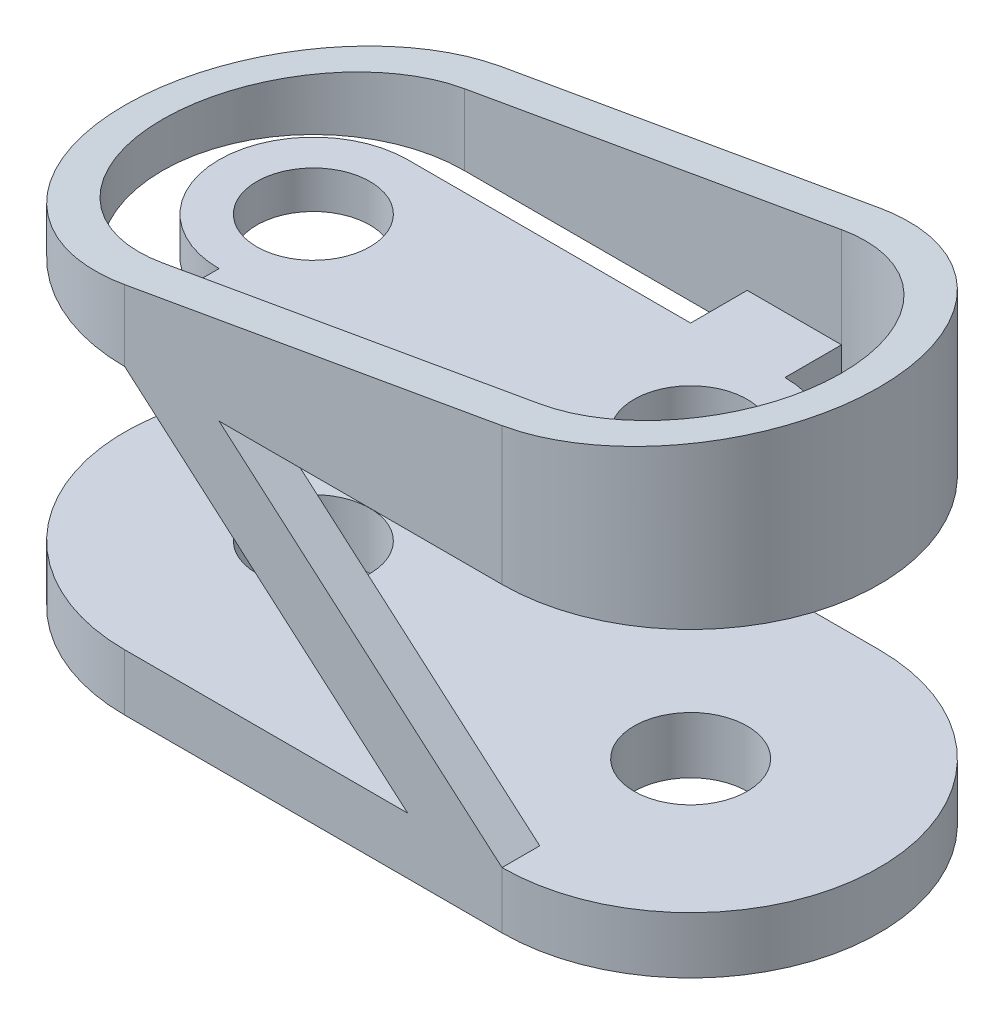
ISO-10303-21;
HEADER;
FILE_DESCRIPTION(('STEP AP214'),'2;1');
FILE_NAME('part.step','',(''),(''),'','','');
FILE_SCHEMA(('AUTOMOTIVE_DESIGN { 1 0 10303 214 1 1 1 1 }'));
ENDSEC;
DATA;
#1=APPLICATION_CONTEXT('core data for automotive mechanical design processes');
#2=APPLICATION_PROTOCOL_DEFINITION('international standard','automotive_design',2000,#1);
#3=PRODUCT_CONTEXT('',#1,'mechanical');
#4=PRODUCT('Part','Part','',(#3));
#5=PRODUCT_RELATED_PRODUCT_CATEGORY('part','',(#4));
#6=PRODUCT_DEFINITION_FORMATION('','',#4);
#7=PRODUCT_DEFINITION_CONTEXT('part definition',#1,'design');
#8=PRODUCT_DEFINITION('design','',#6,#7);
#9=PRODUCT_DEFINITION_SHAPE('','',#8);
#10=(LENGTH_UNIT() NAMED_UNIT(*) SI_UNIT(.MILLI.,.METRE.));
#11=(NAMED_UNIT(*) PLANE_ANGLE_UNIT() SI_UNIT($,.RADIAN.));
#12=(NAMED_UNIT(*) SI_UNIT($,.STERADIAN.) SOLID_ANGLE_UNIT());
#13=UNCERTAINTY_MEASURE_WITH_UNIT(LENGTH_MEASURE(1.E-05),#10,'distance_accuracy_value','');
#14=(GEOMETRIC_REPRESENTATION_CONTEXT(3) GLOBAL_UNCERTAINTY_ASSIGNED_CONTEXT((#13)) GLOBAL_UNIT_ASSIGNED_CONTEXT((#10,
#11,#12)) REPRESENTATION_CONTEXT('',''));
#15=CARTESIAN_POINT('',(0.,0.,0.));
#16=DIRECTION('',(0.,0.,1.));
#17=DIRECTION('',(1.,0.,0.));
#18=AXIS2_PLACEMENT_3D('',#15,#16,#17);
#19=CARTESIAN_POINT('',(0.,90.,-50.));
#20=DIRECTION('',(0.,0.,-1.));
#21=DIRECTION('',(-1.,0.,0.));
#22=AXIS2_PLACEMENT_3D('',#19,#20,#21);
#23=PLANE('',#22);
#24=DIRECTION('',(0.755689082789818,0.654930538417842,0.));
#25=VECTOR('',#24,1.);
#26=CARTESIAN_POINT('',(25.,80.,-50.));
#27=LINE('',#26,#25);
#28=CARTESIAN_POINT('',(-50.,15.,-50.));
#29=VERTEX_POINT('',#28);
#30=CARTESIAN_POINT('',(25.,80.,-50.));
#31=VERTEX_POINT('',#30);
#32=EDGE_CURVE('E320',#29,#31,#27,.T.);
#33=ORIENTED_EDGE('',*,*,#32,.T.);
#34=DIRECTION('',(1.,0.,0.));
#35=VECTOR('',#34,1.);
#36=CARTESIAN_POINT('',(50.,80.,-50.));
#37=LINE('',#36,#35);
#38=CARTESIAN_POINT('',(-50.,80.,-50.));
#39=VERTEX_POINT('',#38);
#40=EDGE_CURVE('E257',#39,#31,#37,.T.);
#41=ORIENTED_EDGE('',*,*,#40,.F.);
#42=DIRECTION('',(0.,-1.,0.));
#43=VECTOR('',#42,1.);
#44=CARTESIAN_POINT('',(-50.,150.,-50.));
#45=LINE('',#44,#43);
#46=CARTESIAN_POINT('',(-50.,98.8163490354229,-50.));
#47=VERTEX_POINT('',#46);
#48=EDGE_CURVE('E294',#47,#39,#45,.T.);
#49=ORIENTED_EDGE('',*,*,#48,.F.);
#50=DIRECTION('',(0.984807753012209,0.173648177666924,0.));
#51=VECTOR('',#50,1.);
#52=CARTESIAN_POINT('',(-3.01536896070435,107.101007166283,-50.));
#53=LINE('',#52,#51);
#54=CARTESIAN_POINT('',(50.,116.449047106269,-50.));
#55=VERTEX_POINT('',#54);
#56=EDGE_CURVE('E286',#47,#55,#53,.T.);
#57=ORIENTED_EDGE('',*,*,#56,.T.);
#58=DIRECTION('',(0.,-1.,0.));
#59=VECTOR('',#58,1.);
#60=CARTESIAN_POINT('',(50.,90.,-50.));
#61=LINE('',#60,#59);
#62=CARTESIAN_POINT('',(50.,80.,-50.));
#63=VERTEX_POINT('',#62);
#64=EDGE_CURVE('E536',#55,#63,#61,.T.);
#65=ORIENTED_EDGE('',*,*,#64,.T.);
#66=DIRECTION('',(-0.755689082789818,-0.654930538417842,0.));
#67=VECTOR('',#66,1.);
#68=CARTESIAN_POINT('',(-25.,15.,-50.));
#69=LINE('',#68,#67);
#70=CARTESIAN_POINT('',(-25.,15.,-50.));
#71=VERTEX_POINT('',#70);
#72=EDGE_CURVE('E219',#63,#71,#69,.T.);
#73=ORIENTED_EDGE('',*,*,#72,.T.);
#74=DIRECTION('',(1.,0.,0.));
#75=VECTOR('',#74,1.);
#76=CARTESIAN_POINT('',(0.,15.,-50.));
#77=LINE('',#76,#75);
#78=CARTESIAN_POINT('',(50.,15.,-50.));
#79=VERTEX_POINT('',#78);
#80=EDGE_CURVE('E353',#71,#79,#77,.T.);
#81=ORIENTED_EDGE('',*,*,#80,.T.);
#82=DIRECTION('',(0.,-1.,0.));
#83=VECTOR('',#82,1.);
#84=CARTESIAN_POINT('',(50.,15.,-50.));
#85=LINE('',#84,#83);
#86=CARTESIAN_POINT('',(50.,0.,-50.));
#87=VERTEX_POINT('',#86);
#88=EDGE_CURVE('E403',#79,#87,#85,.T.);
#89=ORIENTED_EDGE('',*,*,#88,.T.);
#90=DIRECTION('',(1.,0.,0.));
#91=VECTOR('',#90,1.);
#92=CARTESIAN_POINT('',(0.,0.,-50.));
#93=LINE('',#92,#91);
#94=CARTESIAN_POINT('',(-50.,0.,-50.));
#95=VERTEX_POINT('',#94);
#96=EDGE_CURVE('E376',#95,#87,#93,.T.);
#97=ORIENTED_EDGE('',*,*,#96,.F.);
#98=DIRECTION('',(0.,-1.,0.));
#99=VECTOR('',#98,1.);
#100=CARTESIAN_POINT('',(-50.,15.,-50.));
#101=LINE('',#100,#99);
#102=EDGE_CURVE('E400',#29,#95,#101,.T.);
#103=ORIENTED_EDGE('',*,*,#102,.F.);
#104=EDGE_LOOP('',(#33,#41,#49,#57,#65,#73,#81,#89,#97,#103));
#105=FACE_BOUND('',#104,.T.);
#106=ADVANCED_FACE('F41',(#105),#23,.T.);
#107=CARTESIAN_POINT('',(0.,90.,50.));
#108=DIRECTION('',(0.,0.,1.));
#109=DIRECTION('',(1.,0.,0.));
#110=AXIS2_PLACEMENT_3D('',#107,#108,#109);
#111=PLANE('',#110);
#112=DIRECTION('',(-0.755689082789818,0.654930538417842,0.));
#113=VECTOR('',#112,1.);
#114=CARTESIAN_POINT('',(50.,15.,50.));
#115=LINE('',#114,#113);
#116=CARTESIAN_POINT('',(50.,15.,50.));
#117=VERTEX_POINT('',#116);
#118=CARTESIAN_POINT('',(-25.,80.,50.));
#119=VERTEX_POINT('',#118);
#120=EDGE_CURVE('E406',#117,#119,#115,.T.);
#121=ORIENTED_EDGE('',*,*,#120,.T.);
#122=DIRECTION('',(-1.,0.,0.));
#123=VECTOR('',#122,1.);
#124=CARTESIAN_POINT('',(-27.6840938328746,80.,50.));
#125=LINE('',#124,#123);
#126=CARTESIAN_POINT('',(50.,80.,50.));
#127=VERTEX_POINT('',#126);
#128=EDGE_CURVE('E250',#127,#119,#125,.T.);
#129=ORIENTED_EDGE('',*,*,#128,.F.);
#130=DIRECTION('',(0.,-1.,0.));
#131=VECTOR('',#130,1.);
#132=CARTESIAN_POINT('',(50.,150.,50.));
#133=LINE('',#132,#131);
#134=CARTESIAN_POINT('',(50.,116.449047106269,50.));
#135=VERTEX_POINT('',#134);
#136=EDGE_CURVE('E307',#135,#127,#133,.T.);
#137=ORIENTED_EDGE('',*,*,#136,.F.);
#138=DIRECTION('',(-0.984807753012209,-0.173648177666924,0.));
#139=VECTOR('',#138,1.);
#140=CARTESIAN_POINT('',(-3.01536896070435,107.101007166283,50.));
#141=LINE('',#140,#139);
#142=CARTESIAN_POINT('',(-50.,98.8163490354229,50.));
#143=VERTEX_POINT('',#142);
#144=EDGE_CURVE('E282',#135,#143,#141,.T.);
#145=ORIENTED_EDGE('',*,*,#144,.T.);
#146=DIRECTION('',(0.,-1.,0.));
#147=VECTOR('',#146,1.);
#148=CARTESIAN_POINT('',(-50.,90.,50.));
#149=LINE('',#148,#147);
#150=CARTESIAN_POINT('',(-50.,80.,50.));
#151=VERTEX_POINT('',#150);
#152=EDGE_CURVE('E521',#143,#151,#149,.T.);
#153=ORIENTED_EDGE('',*,*,#152,.T.);
#154=DIRECTION('',(0.755689082789818,-0.654930538417842,0.));
#155=VECTOR('',#154,1.);
#156=CARTESIAN_POINT('',(-50.,80.,50.));
#157=LINE('',#156,#155);
#158=CARTESIAN_POINT('',(25.,15.,50.));
#159=VERTEX_POINT('',#158);
#160=EDGE_CURVE('E412',#151,#159,#157,.T.);
#161=ORIENTED_EDGE('',*,*,#160,.T.);
#162=DIRECTION('',(-1.,0.,0.));
#163=VECTOR('',#162,1.);
#164=CARTESIAN_POINT('',(0.,15.,50.));
#165=LINE('',#164,#163);
#166=CARTESIAN_POINT('',(-50.,15.,50.));
#167=VERTEX_POINT('',#166);
#168=EDGE_CURVE('E361',#159,#167,#165,.T.);
#169=ORIENTED_EDGE('',*,*,#168,.T.);
#170=DIRECTION('',(0.,-1.,0.));
#171=VECTOR('',#170,1.);
#172=CARTESIAN_POINT('',(-50.,15.,50.));
#173=LINE('',#172,#171);
#174=CARTESIAN_POINT('',(-50.,0.,50.));
#175=VERTEX_POINT('',#174);
#176=EDGE_CURVE('E397',#167,#175,#173,.T.);
#177=ORIENTED_EDGE('',*,*,#176,.T.);
#178=DIRECTION('',(-1.,0.,0.));
#179=VECTOR('',#178,1.);
#180=CARTESIAN_POINT('',(0.,0.,50.));
#181=LINE('',#180,#179);
#182=CARTESIAN_POINT('',(50.,0.,50.));
#183=VERTEX_POINT('',#182);
#184=EDGE_CURVE('E384',#183,#175,#181,.T.);
#185=ORIENTED_EDGE('',*,*,#184,.F.);
#186=DIRECTION('',(0.,-1.,0.));
#187=VECTOR('',#186,1.);
#188=CARTESIAN_POINT('',(50.,15.,50.));
#189=LINE('',#188,#187);
#190=EDGE_CURVE('E372',#117,#183,#189,.T.);
#191=ORIENTED_EDGE('',*,*,#190,.F.);
#192=EDGE_LOOP('',(#121,#129,#137,#145,#153,#161,#169,#177,#185,#191));
#193=FACE_BOUND('',#192,.T.);
#194=ADVANCED_FACE('F628',(#193),#111,.T.);
#195=CARTESIAN_POINT('',(50.,150.,0.));
#196=DIRECTION('',(0.,-1.,0.));
#197=DIRECTION('',(0.,0.,-1.));
#198=AXIS2_PLACEMENT_3D('',#195,#196,#197);
#199=CYLINDRICAL_SURFACE('',#198,40.);
#200=DIRECTION('',(0.,-1.,0.));
#201=VECTOR('',#200,1.);
#202=CARTESIAN_POINT('',(50.,150.,40.));
#203=LINE('',#202,#201);
#204=CARTESIAN_POINT('',(50.,116.449047106269,40.));
#205=VERTEX_POINT('',#204);
#206=CARTESIAN_POINT('',(50.,80.,40.));
#207=VERTEX_POINT('',#206);
#208=EDGE_CURVE('E209',#205,#207,#203,.T.);
#209=ORIENTED_EDGE('',*,*,#208,.F.);
#210=CARTESIAN_POINT('',(50.,116.449047106269,0.));
#211=DIRECTION('',(-0.173648177666924,0.984807753012209,0.));
#212=DIRECTION('',(-0.984807753012209,-0.173648177666924,0.));
#213=AXIS2_PLACEMENT_3D('',#210,#211,#212);
#214=ELLIPSE('',#213,40.6170644754297,40.);
#215=CARTESIAN_POINT('',(50.,116.449047106269,-40.));
#216=VERTEX_POINT('',#215);
#217=EDGE_CURVE('E275',#205,#216,#214,.T.);
#218=ORIENTED_EDGE('',*,*,#217,.T.);
#219=DIRECTION('',(0.,-1.,0.));
#220=VECTOR('',#219,1.);
#221=CARTESIAN_POINT('',(50.,150.,-40.));
#222=LINE('',#221,#220);
#223=CARTESIAN_POINT('',(50.,90.,-40.));
#224=VERTEX_POINT('',#223);
#225=EDGE_CURVE('E303',#216,#224,#222,.T.);
#226=ORIENTED_EDGE('',*,*,#225,.T.);
#227=DIRECTION('',(0.,1.,0.));
#228=VECTOR('',#227,1.);
#229=CARTESIAN_POINT('',(50.,80.,-40.));
#230=LINE('',#229,#228);
#231=CARTESIAN_POINT('',(50.,80.,-40.));
#232=VERTEX_POINT('',#231);
#233=EDGE_CURVE('E226',#232,#224,#230,.T.);
#234=ORIENTED_EDGE('',*,*,#233,.F.);
#235=CARTESIAN_POINT('',(50.,80.,0.));
#236=DIRECTION('',(0.,-1.,0.));
#237=DIRECTION('',(0.,0.,-1.));
#238=AXIS2_PLACEMENT_3D('',#235,#236,#237);
#239=CIRCLE('',#238,40.);
#240=EDGE_CURVE('E223',#232,#207,#239,.T.);
#241=ORIENTED_EDGE('',*,*,#240,.T.);
#242=EDGE_LOOP('',(#209,#218,#226,#234,#241));
#243=FACE_BOUND('',#242,.T.);
#244=ADVANCED_FACE('F224',(#243),#199,.F.);
#245=CARTESIAN_POINT('',(0.,150.,40.));
#246=DIRECTION('',(0.,0.,1.));
#247=DIRECTION('',(1.,0.,0.));
#248=AXIS2_PLACEMENT_3D('',#245,#246,#247);
#249=PLANE('',#248);
#250=DIRECTION('',(-0.984807753012209,-0.173648177666924,0.));
#251=VECTOR('',#250,1.);
#252=CARTESIAN_POINT('',(7.24523533906533,108.910228542705,40.));
#253=LINE('',#252,#251);
#254=CARTESIAN_POINT('',(-50.,98.8163490354229,40.));
#255=VERTEX_POINT('',#254);
#256=EDGE_CURVE('E57',#205,#255,#253,.T.);
#257=ORIENTED_EDGE('',*,*,#256,.F.);
#258=ORIENTED_EDGE('',*,*,#208,.T.);
#259=DIRECTION('',(-1.,0.,0.));
#260=VECTOR('',#259,1.);
#261=CARTESIAN_POINT('',(-50.,80.,40.));
#262=LINE('',#261,#260);
#263=CARTESIAN_POINT('',(-25.,80.,40.));
#264=VERTEX_POINT('',#263);
#265=EDGE_CURVE('E213',#207,#264,#262,.T.);
#266=ORIENTED_EDGE('',*,*,#265,.T.);
#267=DIRECTION('',(0.,-1.,0.));
#268=VECTOR('',#267,1.);
#269=CARTESIAN_POINT('',(-25.,90.,40.));
#270=LINE('',#269,#268);
#271=CARTESIAN_POINT('',(-25.,90.,40.));
#272=VERTEX_POINT('',#271);
#273=EDGE_CURVE('E268',#272,#264,#270,.T.);
#274=ORIENTED_EDGE('',*,*,#273,.F.);
#275=DIRECTION('',(-1.,0.,0.));
#276=VECTOR('',#275,1.);
#277=CARTESIAN_POINT('',(0.,90.,40.));
#278=LINE('',#277,#276);
#279=CARTESIAN_POINT('',(-50.,90.,40.));
#280=VERTEX_POINT('',#279);
#281=EDGE_CURVE('E295',#272,#280,#278,.T.);
#282=ORIENTED_EDGE('',*,*,#281,.T.);
#283=DIRECTION('',(0.,-1.,0.));
#284=VECTOR('',#283,1.);
#285=CARTESIAN_POINT('',(-50.,150.,40.));
#286=LINE('',#285,#284);
#287=EDGE_CURVE('E220',#255,#280,#286,.T.);
#288=ORIENTED_EDGE('',*,*,#287,.F.);
#289=EDGE_LOOP('',(#257,#258,#266,#274,#282,#288));
#290=FACE_BOUND('',#289,.T.);
#291=ADVANCED_FACE('F211',(#290),#249,.F.);
#292=CARTESIAN_POINT('',(-50.,150.,0.));
#293=DIRECTION('',(0.,-1.,0.));
#294=DIRECTION('',(0.,0.,-1.));
#295=AXIS2_PLACEMENT_3D('',#292,#293,#294);
#296=CYLINDRICAL_SURFACE('',#295,40.);
#297=DIRECTION('',(0.,-1.,0.));
#298=VECTOR('',#297,1.);
#299=CARTESIAN_POINT('',(-50.,150.,-40.));
#300=LINE('',#299,#298);
#301=CARTESIAN_POINT('',(-50.,98.8163490354229,-40.));
#302=VERTEX_POINT('',#301);
#303=CARTESIAN_POINT('',(-50.,80.,-40.));
#304=VERTEX_POINT('',#303);
#305=EDGE_CURVE('E306',#302,#304,#300,.T.);
#306=ORIENTED_EDGE('',*,*,#305,.F.);
#307=CARTESIAN_POINT('',(-50.,98.8163490354229,0.));
#308=DIRECTION('',(-0.173648177666924,0.984807753012209,0.));
#309=DIRECTION('',(-0.984807753012209,-0.173648177666924,0.));
#310=AXIS2_PLACEMENT_3D('',#307,#308,#309);
#311=ELLIPSE('',#310,40.6170644754297,40.);
#312=EDGE_CURVE('E65',#302,#255,#311,.T.);
#313=ORIENTED_EDGE('',*,*,#312,.T.);
#314=ORIENTED_EDGE('',*,*,#287,.T.);
#315=DIRECTION('',(0.,1.,0.));
#316=VECTOR('',#315,1.);
#317=CARTESIAN_POINT('',(-50.,80.,40.));
#318=LINE('',#317,#316);
#319=CARTESIAN_POINT('',(-50.,80.,40.));
#320=VERTEX_POINT('',#319);
#321=EDGE_CURVE('E247',#320,#280,#318,.T.);
#322=ORIENTED_EDGE('',*,*,#321,.F.);
#323=CARTESIAN_POINT('',(-50.,80.,0.));
#324=DIRECTION('',(0.,-1.,0.));
#325=DIRECTION('',(0.,0.,-1.));
#326=AXIS2_PLACEMENT_3D('',#323,#324,#325);
#327=CIRCLE('',#326,40.);
#328=EDGE_CURVE('E235',#320,#304,#327,.T.);
#329=ORIENTED_EDGE('',*,*,#328,.T.);
#330=EDGE_LOOP('',(#306,#313,#314,#322,#329));
#331=FACE_BOUND('',#330,.T.);
#332=ADVANCED_FACE('F646',(#331),#296,.F.);
#333=CARTESIAN_POINT('',(-50.,150.,0.));
#334=DIRECTION('',(0.,-1.,0.));
#335=DIRECTION('',(0.,0.,-1.));
#336=AXIS2_PLACEMENT_3D('',#333,#334,#335);
#337=CYLINDRICAL_SURFACE('',#336,50.);
#338=CARTESIAN_POINT('',(-50.,98.8163490354229,0.));
#339=DIRECTION('',(-0.173648177666924,0.984807753012209,0.));
#340=DIRECTION('',(-0.984807753012209,-0.173648177666924,0.));
#341=AXIS2_PLACEMENT_3D('',#338,#339,#340);
#342=ELLIPSE('',#341,50.7713305942872,50.);
#343=EDGE_CURVE('E290',#47,#143,#342,.T.);
#344=ORIENTED_EDGE('',*,*,#343,.F.);
#345=ORIENTED_EDGE('',*,*,#48,.T.);
#346=CARTESIAN_POINT('',(-50.,80.,0.));
#347=DIRECTION('',(0.,-1.,0.));
#348=DIRECTION('',(0.,0.,-1.));
#349=AXIS2_PLACEMENT_3D('',#346,#347,#348);
#350=CIRCLE('',#349,50.);
#351=EDGE_CURVE('E253',#151,#39,#350,.T.);
#352=ORIENTED_EDGE('',*,*,#351,.F.);
#353=ORIENTED_EDGE('',*,*,#152,.F.);
#354=EDGE_LOOP('',(#344,#345,#352,#353));
#355=FACE_BOUND('',#354,.T.);
#356=ADVANCED_FACE('F641',(#355),#337,.T.);
#357=CARTESIAN_POINT('',(50.,150.,0.));
#358=DIRECTION('',(0.,-1.,0.));
#359=DIRECTION('',(0.,0.,-1.));
#360=AXIS2_PLACEMENT_3D('',#357,#358,#359);
#361=CYLINDRICAL_SURFACE('',#360,50.);
#362=CARTESIAN_POINT('',(50.,116.449047106269,0.));
#363=DIRECTION('',(-0.173648177666924,0.984807753012209,0.));
#364=DIRECTION('',(-0.984807753012209,-0.173648177666924,0.));
#365=AXIS2_PLACEMENT_3D('',#362,#363,#364);
#366=ELLIPSE('',#365,50.7713305942872,50.);
#367=EDGE_CURVE('E278',#135,#55,#366,.T.);
#368=ORIENTED_EDGE('',*,*,#367,.F.);
#369=ORIENTED_EDGE('',*,*,#136,.T.);
#370=CARTESIAN_POINT('',(50.,80.,0.));
#371=DIRECTION('',(0.,-1.,0.));
#372=DIRECTION('',(0.,0.,-1.));
#373=AXIS2_PLACEMENT_3D('',#370,#371,#372);
#374=CIRCLE('',#373,50.);
#375=EDGE_CURVE('E260',#63,#127,#374,.T.);
#376=ORIENTED_EDGE('',*,*,#375,.F.);
#377=ORIENTED_EDGE('',*,*,#64,.F.);
#378=EDGE_LOOP('',(#368,#369,#376,#377));
#379=FACE_BOUND('',#378,.T.);
#380=ADVANCED_FACE('F620',(#379),#361,.T.);
#381=CARTESIAN_POINT('',(0.,150.,-40.));
#382=DIRECTION('',(0.,0.,-1.));
#383=DIRECTION('',(-1.,0.,0.));
#384=AXIS2_PLACEMENT_3D('',#381,#382,#383);
#385=PLANE('',#384);
#386=DIRECTION('',(0.984807753012209,0.173648177666924,0.));
#387=VECTOR('',#386,1.);
#388=CARTESIAN_POINT('',(7.24523533906533,108.910228542705,-40.));
#389=LINE('',#388,#387);
#390=EDGE_CURVE('E11',#302,#216,#389,.T.);
#391=ORIENTED_EDGE('',*,*,#390,.F.);
#392=ORIENTED_EDGE('',*,*,#305,.T.);
#393=DIRECTION('',(1.,0.,0.));
#394=VECTOR('',#393,1.);
#395=CARTESIAN_POINT('',(-50.,80.,-40.));
#396=LINE('',#395,#394);
#397=CARTESIAN_POINT('',(25.,80.,-40.));
#398=VERTEX_POINT('',#397);
#399=EDGE_CURVE('E239',#304,#398,#396,.T.);
#400=ORIENTED_EDGE('',*,*,#399,.T.);
#401=DIRECTION('',(0.,-1.,0.));
#402=VECTOR('',#401,1.);
#403=CARTESIAN_POINT('',(25.,90.,-40.));
#404=LINE('',#403,#402);
#405=CARTESIAN_POINT('',(25.,90.,-40.));
#406=VERTEX_POINT('',#405);
#407=EDGE_CURVE('E264',#406,#398,#404,.T.);
#408=ORIENTED_EDGE('',*,*,#407,.F.);
#409=DIRECTION('',(1.,0.,0.));
#410=VECTOR('',#409,1.);
#411=CARTESIAN_POINT('',(0.,90.,-40.));
#412=LINE('',#411,#410);
#413=EDGE_CURVE('E50',#406,#224,#412,.T.);
#414=ORIENTED_EDGE('',*,*,#413,.T.);
#415=ORIENTED_EDGE('',*,*,#225,.F.);
#416=EDGE_LOOP('',(#391,#392,#400,#408,#414,#415));
#417=FACE_BOUND('',#416,.T.);
#418=ADVANCED_FACE('F583',(#417),#385,.F.);
#419=CARTESIAN_POINT('',(0.,90.,25.));
#420=DIRECTION('',(0.,0.,1.));
#421=DIRECTION('',(1.,0.,0.));
#422=AXIS2_PLACEMENT_3D('',#419,#420,#421);
#423=PLANE('',#422);
#424=DIRECTION('',(-1.,0.,0.));
#425=VECTOR('',#424,1.);
#426=CARTESIAN_POINT('',(0.,80.,25.));
#427=LINE('',#426,#425);
#428=CARTESIAN_POINT('',(50.,80.,25.));
#429=VERTEX_POINT('',#428);
#430=CARTESIAN_POINT('',(-25.,80.,25.));
#431=VERTEX_POINT('',#430);
#432=EDGE_CURVE('E487',#429,#431,#427,.T.);
#433=ORIENTED_EDGE('',*,*,#432,.F.);
#434=DIRECTION('',(0.,-1.,0.));
#435=VECTOR('',#434,1.);
#436=CARTESIAN_POINT('',(50.,90.,25.));
#437=LINE('',#436,#435);
#438=CARTESIAN_POINT('',(50.,90.,25.));
#439=VERTEX_POINT('',#438);
#440=EDGE_CURVE('E299',#439,#429,#437,.T.);
#441=ORIENTED_EDGE('',*,*,#440,.F.);
#442=DIRECTION('',(-1.,0.,0.));
#443=VECTOR('',#442,1.);
#444=CARTESIAN_POINT('',(0.,90.,25.));
#445=LINE('',#444,#443);
#446=CARTESIAN_POINT('',(-25.,90.,25.));
#447=VERTEX_POINT('',#446);
#448=EDGE_CURVE('E449',#439,#447,#445,.T.);
#449=ORIENTED_EDGE('',*,*,#448,.T.);
#450=DIRECTION('',(0.,-1.,0.));
#451=VECTOR('',#450,1.);
#452=CARTESIAN_POINT('',(-25.,90.,25.));
#453=LINE('',#452,#451);
#454=EDGE_CURVE('E479',#447,#431,#453,.T.);
#455=ORIENTED_EDGE('',*,*,#454,.T.);
#456=EDGE_LOOP('',(#433,#441,#449,#455));
#457=FACE_BOUND('',#456,.T.);
#458=ADVANCED_FACE('F556',(#457),#423,.T.);
#459=CARTESIAN_POINT('',(50.,90.,0.));
#460=DIRECTION('',(0.,-1.,0.));
#461=DIRECTION('',(0.,0.,-1.));
#462=AXIS2_PLACEMENT_3D('',#459,#460,#461);
#463=CYLINDRICAL_SURFACE('',#462,25.);
#464=CARTESIAN_POINT('',(50.,80.,0.));
#465=DIRECTION('',(0.,1.,0.));
#466=DIRECTION('',(0.,0.,1.));
#467=AXIS2_PLACEMENT_3D('',#464,#465,#466);
#468=CIRCLE('',#467,25.);
#469=CARTESIAN_POINT('',(50.,80.,-25.));
#470=VERTEX_POINT('',#469);
#471=EDGE_CURVE('E491',#429,#470,#468,.T.);
#472=ORIENTED_EDGE('',*,*,#471,.T.);
#473=DIRECTION('',(0.,-1.,0.));
#474=VECTOR('',#473,1.);
#475=CARTESIAN_POINT('',(50.,90.,-25.));
#476=LINE('',#475,#474);
#477=CARTESIAN_POINT('',(50.,90.,-25.));
#478=VERTEX_POINT('',#477);
#479=EDGE_CURVE('E540',#478,#470,#476,.T.);
#480=ORIENTED_EDGE('',*,*,#479,.F.);
#481=CARTESIAN_POINT('',(50.,90.,0.));
#482=DIRECTION('',(0.,1.,0.));
#483=DIRECTION('',(0.,0.,1.));
#484=AXIS2_PLACEMENT_3D('',#481,#482,#483);
#485=CIRCLE('',#484,25.);
#486=EDGE_CURVE('E453',#439,#478,#485,.T.);
#487=ORIENTED_EDGE('',*,*,#486,.F.);
#488=ORIENTED_EDGE('',*,*,#440,.T.);
#489=EDGE_LOOP('',(#472,#480,#487,#488));
#490=FACE_BOUND('',#489,.T.);
#491=ADVANCED_FACE('F547',(#490),#463,.T.);
#492=CARTESIAN_POINT('',(50.,90.,0.));
#493=DIRECTION('',(-1.,0.,0.));
#494=DIRECTION('',(0.,0.,1.));
#495=AXIS2_PLACEMENT_3D('',#492,#493,#494);
#496=PLANE('',#495);
#497=DIRECTION('',(0.,0.,-1.));
#498=VECTOR('',#497,1.);
#499=CARTESIAN_POINT('',(50.,80.,0.));
#500=LINE('',#499,#498);
#501=EDGE_CURVE('E495',#470,#232,#500,.T.);
#502=ORIENTED_EDGE('',*,*,#501,.T.);
#503=ORIENTED_EDGE('',*,*,#233,.T.);
#504=DIRECTION('',(0.,0.,-1.));
#505=VECTOR('',#504,1.);
#506=CARTESIAN_POINT('',(50.,90.,0.));
#507=LINE('',#506,#505);
#508=EDGE_CURVE('E457',#478,#224,#507,.T.);
#509=ORIENTED_EDGE('',*,*,#508,.F.);
#510=ORIENTED_EDGE('',*,*,#479,.T.);
#511=EDGE_LOOP('',(#502,#503,#509,#510));
#512=FACE_BOUND('',#511,.T.);
#513=ADVANCED_FACE('F614',(#512),#496,.F.);
#514=CARTESIAN_POINT('',(25.,90.,0.));
#515=DIRECTION('',(1.,0.,0.));
#516=DIRECTION('',(0.,0.,-1.));
#517=AXIS2_PLACEMENT_3D('',#514,#515,#516);
#518=PLANE('',#517);
#519=DIRECTION('',(0.,0.,1.));
#520=VECTOR('',#519,1.);
#521=CARTESIAN_POINT('',(25.,90.,0.));
#522=LINE('',#521,#520);
#523=CARTESIAN_POINT('',(25.,90.,-25.));
#524=VERTEX_POINT('',#523);
#525=EDGE_CURVE('E461',#406,#524,#522,.T.);
#526=ORIENTED_EDGE('',*,*,#525,.F.);
#527=ORIENTED_EDGE('',*,*,#407,.T.);
#528=DIRECTION('',(0.,0.,1.));
#529=VECTOR('',#528,1.);
#530=CARTESIAN_POINT('',(25.,80.,0.));
#531=LINE('',#530,#529);
#532=CARTESIAN_POINT('',(25.,80.,-25.));
#533=VERTEX_POINT('',#532);
#534=EDGE_CURVE('E499',#398,#533,#531,.T.);
#535=ORIENTED_EDGE('',*,*,#534,.T.);
#536=DIRECTION('',(0.,-1.,0.));
#537=VECTOR('',#536,1.);
#538=CARTESIAN_POINT('',(25.,90.,-25.));
#539=LINE('',#538,#537);
#540=EDGE_CURVE('E532',#524,#533,#539,.T.);
#541=ORIENTED_EDGE('',*,*,#540,.F.);
#542=EDGE_LOOP('',(#526,#527,#535,#541));
#543=FACE_BOUND('',#542,.T.);
#544=ADVANCED_FACE('F567',(#543),#518,.F.);
#545=CARTESIAN_POINT('',(0.,90.,-25.));
#546=DIRECTION('',(0.,0.,-1.));
#547=DIRECTION('',(-1.,0.,0.));
#548=AXIS2_PLACEMENT_3D('',#545,#546,#547);
#549=PLANE('',#548);
#550=DIRECTION('',(1.,0.,0.));
#551=VECTOR('',#550,1.);
#552=CARTESIAN_POINT('',(0.,80.,-25.));
#553=LINE('',#552,#551);
#554=CARTESIAN_POINT('',(-50.,80.,-25.));
#555=VERTEX_POINT('',#554);
#556=EDGE_CURVE('E503',#555,#533,#553,.T.);
#557=ORIENTED_EDGE('',*,*,#556,.F.);
#558=DIRECTION('',(0.,-1.,0.));
#559=VECTOR('',#558,1.);
#560=CARTESIAN_POINT('',(-50.,90.,-25.));
#561=LINE('',#560,#559);
#562=CARTESIAN_POINT('',(-50.,90.,-25.));
#563=VERTEX_POINT('',#562);
#564=EDGE_CURVE('E529',#563,#555,#561,.T.);
#565=ORIENTED_EDGE('',*,*,#564,.F.);
#566=DIRECTION('',(1.,0.,0.));
#567=VECTOR('',#566,1.);
#568=CARTESIAN_POINT('',(0.,90.,-25.));
#569=LINE('',#568,#567);
#570=EDGE_CURVE('E464',#563,#524,#569,.T.);
#571=ORIENTED_EDGE('',*,*,#570,.T.);
#572=ORIENTED_EDGE('',*,*,#540,.T.);
#573=EDGE_LOOP('',(#557,#565,#571,#572));
#574=FACE_BOUND('',#573,.T.);
#575=ADVANCED_FACE('F571',(#574),#549,.T.);
#576=CARTESIAN_POINT('',(-50.,90.,0.));
#577=DIRECTION('',(0.,-1.,0.));
#578=DIRECTION('',(0.,0.,-1.));
#579=AXIS2_PLACEMENT_3D('',#576,#577,#578);
#580=CYLINDRICAL_SURFACE('',#579,25.);
#581=CARTESIAN_POINT('',(-50.,80.,0.));
#582=DIRECTION('',(0.,1.,0.));
#583=DIRECTION('',(0.,0.,1.));
#584=AXIS2_PLACEMENT_3D('',#581,#582,#583);
#585=CIRCLE('',#584,25.);
#586=CARTESIAN_POINT('',(-50.,80.,25.));
#587=VERTEX_POINT('',#586);
#588=EDGE_CURVE('E507',#555,#587,#585,.T.);
#589=ORIENTED_EDGE('',*,*,#588,.T.);
#590=DIRECTION('',(0.,-1.,0.));
#591=VECTOR('',#590,1.);
#592=CARTESIAN_POINT('',(-50.,90.,25.));
#593=LINE('',#592,#591);
#594=CARTESIAN_POINT('',(-50.,90.,25.));
#595=VERTEX_POINT('',#594);
#596=EDGE_CURVE('E525',#595,#587,#593,.T.);
#597=ORIENTED_EDGE('',*,*,#596,.F.);
#598=CARTESIAN_POINT('',(-50.,90.,0.));
#599=DIRECTION('',(0.,1.,0.));
#600=DIRECTION('',(0.,0.,1.));
#601=AXIS2_PLACEMENT_3D('',#598,#599,#600);
#602=CIRCLE('',#601,25.);
#603=EDGE_CURVE('E468',#563,#595,#602,.T.);
#604=ORIENTED_EDGE('',*,*,#603,.F.);
#605=ORIENTED_EDGE('',*,*,#564,.T.);
#606=EDGE_LOOP('',(#589,#597,#604,#605));
#607=FACE_BOUND('',#606,.T.);
#608=ADVANCED_FACE('F576',(#607),#580,.T.);
#609=CARTESIAN_POINT('',(-50.,90.,0.));
#610=DIRECTION('',(1.,0.,0.));
#611=DIRECTION('',(0.,0.,-1.));
#612=AXIS2_PLACEMENT_3D('',#609,#610,#611);
#613=PLANE('',#612);
#614=DIRECTION('',(0.,0.,1.));
#615=VECTOR('',#614,1.);
#616=CARTESIAN_POINT('',(-50.,80.,0.));
#617=LINE('',#616,#615);
#618=EDGE_CURVE('E511',#587,#320,#617,.T.);
#619=ORIENTED_EDGE('',*,*,#618,.T.);
#620=ORIENTED_EDGE('',*,*,#321,.T.);
#621=DIRECTION('',(0.,0.,1.));
#622=VECTOR('',#621,1.);
#623=CARTESIAN_POINT('',(-50.,90.,0.));
#624=LINE('',#623,#622);
#625=EDGE_CURVE('E472',#595,#280,#624,.T.);
#626=ORIENTED_EDGE('',*,*,#625,.F.);
#627=ORIENTED_EDGE('',*,*,#596,.T.);
#628=EDGE_LOOP('',(#619,#620,#626,#627));
#629=FACE_BOUND('',#628,.T.);
#630=ADVANCED_FACE('F643',(#629),#613,.F.);
#631=CARTESIAN_POINT('',(-50.,90.,0.));
#632=DIRECTION('',(0.,-1.,0.));
#633=DIRECTION('',(0.,0.,-1.));
#634=AXIS2_PLACEMENT_3D('',#631,#632,#633);
#635=CYLINDRICAL_SURFACE('',#634,15.);
#636=CARTESIAN_POINT('',(-50.,90.,0.));
#637=DIRECTION('',(0.,1.,0.));
#638=DIRECTION('',(0.,0.,1.));
#639=AXIS2_PLACEMENT_3D('',#636,#637,#638);
#640=CIRCLE('',#639,15.);
#641=CARTESIAN_POINT('',(-50.,90.,15.));
#642=VERTEX_POINT('',#641);
#643=EDGE_CURVE('E445',#642,#642,#640,.T.);
#644=ORIENTED_EDGE('',*,*,#643,.T.);
#645=EDGE_LOOP('',(#644));
#646=FACE_BOUND('',#645,.T.);
#647=CARTESIAN_POINT('',(-50.,80.,0.));
#648=DIRECTION('',(0.,1.,0.));
#649=DIRECTION('',(0.,0.,1.));
#650=AXIS2_PLACEMENT_3D('',#647,#648,#649);
#651=CIRCLE('',#650,15.);
#652=CARTESIAN_POINT('',(-50.,80.,15.));
#653=VERTEX_POINT('',#652);
#654=EDGE_CURVE('E483',#653,#653,#651,.T.);
#655=ORIENTED_EDGE('',*,*,#654,.F.);
#656=EDGE_LOOP('',(#655));
#657=FACE_BOUND('',#656,.T.);
#658=ADVANCED_FACE('F670',(#646,#657),#635,.F.);
#659=CARTESIAN_POINT('',(50.,90.,0.));
#660=DIRECTION('',(0.,-1.,0.));
#661=DIRECTION('',(0.,0.,-1.));
#662=AXIS2_PLACEMENT_3D('',#659,#660,#661);
#663=CYLINDRICAL_SURFACE('',#662,15.);
#664=CARTESIAN_POINT('',(50.,90.,0.));
#665=DIRECTION('',(0.,1.,0.));
#666=DIRECTION('',(0.,0.,1.));
#667=AXIS2_PLACEMENT_3D('',#664,#665,#666);
#668=CIRCLE('',#667,15.);
#669=CARTESIAN_POINT('',(50.,90.,15.));
#670=VERTEX_POINT('',#669);
#671=EDGE_CURVE('E441',#670,#670,#668,.T.);
#672=ORIENTED_EDGE('',*,*,#671,.T.);
#673=EDGE_LOOP('',(#672));
#674=FACE_BOUND('',#673,.T.);
#675=CARTESIAN_POINT('',(50.,80.,0.));
#676=DIRECTION('',(0.,1.,0.));
#677=DIRECTION('',(0.,0.,1.));
#678=AXIS2_PLACEMENT_3D('',#675,#676,#677);
#679=CIRCLE('',#678,15.);
#680=CARTESIAN_POINT('',(50.,80.,15.));
#681=VERTEX_POINT('',#680);
#682=EDGE_CURVE('E434',#681,#681,#679,.T.);
#683=ORIENTED_EDGE('',*,*,#682,.F.);
#684=EDGE_LOOP('',(#683));
#685=FACE_BOUND('',#684,.T.);
#686=ADVANCED_FACE('F43',(#674,#685),#663,.F.);
#687=CARTESIAN_POINT('',(-25.,90.,0.));
#688=DIRECTION('',(-1.,0.,0.));
#689=DIRECTION('',(0.,0.,1.));
#690=AXIS2_PLACEMENT_3D('',#687,#688,#689);
#691=PLANE('',#690);
#692=DIRECTION('',(0.,0.,-1.));
#693=VECTOR('',#692,1.);
#694=CARTESIAN_POINT('',(-25.,90.,0.));
#695=LINE('',#694,#693);
#696=EDGE_CURVE('E476',#272,#447,#695,.T.);
#697=ORIENTED_EDGE('',*,*,#696,.F.);
#698=ORIENTED_EDGE('',*,*,#273,.T.);
#699=DIRECTION('',(0.,0.,-1.));
#700=VECTOR('',#699,1.);
#701=CARTESIAN_POINT('',(-25.,80.,0.));
#702=LINE('',#701,#700);
#703=EDGE_CURVE('E515',#264,#431,#702,.T.);
#704=ORIENTED_EDGE('',*,*,#703,.T.);
#705=ORIENTED_EDGE('',*,*,#454,.F.);
#706=EDGE_LOOP('',(#697,#698,#704,#705));
#707=FACE_BOUND('',#706,.T.);
#708=ADVANCED_FACE('F560',(#707),#691,.F.);
#709=CARTESIAN_POINT('',(0.,90.,0.));
#710=DIRECTION('',(0.,1.,0.));
#711=DIRECTION('',(0.,0.,1.));
#712=AXIS2_PLACEMENT_3D('',#709,#710,#711);
#713=PLANE('',#712);
#714=ORIENTED_EDGE('',*,*,#413,.F.);
#715=ORIENTED_EDGE('',*,*,#525,.T.);
#716=ORIENTED_EDGE('',*,*,#570,.F.);
#717=ORIENTED_EDGE('',*,*,#603,.T.);
#718=ORIENTED_EDGE('',*,*,#625,.T.);
#719=ORIENTED_EDGE('',*,*,#281,.F.);
#720=ORIENTED_EDGE('',*,*,#696,.T.);
#721=ORIENTED_EDGE('',*,*,#448,.F.);
#722=ORIENTED_EDGE('',*,*,#486,.T.);
#723=ORIENTED_EDGE('',*,*,#508,.T.);
#724=EDGE_LOOP('',(#714,#715,#716,#717,#718,#719,#720,#721,#722,#723));
#725=FACE_BOUND('',#724,.T.);
#726=ORIENTED_EDGE('',*,*,#671,.F.);
#727=EDGE_LOOP('',(#726));
#728=FACE_BOUND('',#727,.T.);
#729=ORIENTED_EDGE('',*,*,#643,.F.);
#730=EDGE_LOOP('',(#729));
#731=FACE_BOUND('',#730,.T.);
#732=ADVANCED_FACE('F580',(#725,#728,#731),#713,.T.);
#733=CARTESIAN_POINT('',(0.,80.,0.));
#734=DIRECTION('',(0.,1.,0.));
#735=DIRECTION('',(0.,0.,1.));
#736=AXIS2_PLACEMENT_3D('',#733,#734,#735);
#737=PLANE('',#736);
#738=ORIENTED_EDGE('',*,*,#682,.T.);
#739=EDGE_LOOP('',(#738));
#740=FACE_BOUND('',#739,.T.);
#741=ORIENTED_EDGE('',*,*,#654,.T.);
#742=EDGE_LOOP('',(#741));
#743=FACE_BOUND('',#742,.T.);
#744=ORIENTED_EDGE('',*,*,#534,.F.);
#745=DIRECTION('',(1.,0.,0.));
#746=VECTOR('',#745,1.);
#747=CARTESIAN_POINT('',(50.,80.,-40.));
#748=LINE('',#747,#746);
#749=EDGE_CURVE('E316',#398,#232,#748,.T.);
#750=ORIENTED_EDGE('',*,*,#749,.T.);
#751=ORIENTED_EDGE('',*,*,#501,.F.);
#752=ORIENTED_EDGE('',*,*,#471,.F.);
#753=ORIENTED_EDGE('',*,*,#432,.T.);
#754=ORIENTED_EDGE('',*,*,#703,.F.);
#755=DIRECTION('',(-1.,0.,0.));
#756=VECTOR('',#755,1.);
#757=CARTESIAN_POINT('',(-25.,80.,40.));
#758=LINE('',#757,#756);
#759=EDGE_CURVE('E416',#264,#320,#758,.T.);
#760=ORIENTED_EDGE('',*,*,#759,.T.);
#761=ORIENTED_EDGE('',*,*,#618,.F.);
#762=ORIENTED_EDGE('',*,*,#588,.F.);
#763=ORIENTED_EDGE('',*,*,#556,.T.);
#764=EDGE_LOOP('',(#744,#750,#751,#752,#753,#754,#760,#761,#762,#763));
#765=FACE_BOUND('',#764,.T.);
#766=ADVANCED_FACE('F554',(#740,#743,#765),#737,.F.);
#767=CARTESIAN_POINT('',(-50.,80.,40.));
#768=DIRECTION('',(-0.654930538417842,-0.755689082789818,0.));
#769=DIRECTION('',(0.755689082789818,-0.654930538417842,0.));
#770=AXIS2_PLACEMENT_3D('',#767,#768,#769);
#771=PLANE('',#770);
#772=ORIENTED_EDGE('',*,*,#160,.F.);
#773=DIRECTION('',(0.,0.,1.));
#774=VECTOR('',#773,1.);
#775=CARTESIAN_POINT('',(-50.,80.,40.));
#776=LINE('',#775,#774);
#777=EDGE_CURVE('E435',#320,#151,#776,.T.);
#778=ORIENTED_EDGE('',*,*,#777,.F.);
#779=DIRECTION('',(0.755689082789818,-0.654930538417842,0.));
#780=VECTOR('',#779,1.);
#781=CARTESIAN_POINT('',(-50.,80.,40.));
#782=LINE('',#781,#780);
#783=CARTESIAN_POINT('',(25.,15.,40.));
#784=VERTEX_POINT('',#783);
#785=EDGE_CURVE('E420',#320,#784,#782,.T.);
#786=ORIENTED_EDGE('',*,*,#785,.T.);
#787=DIRECTION('',(0.,0.,1.));
#788=VECTOR('',#787,1.);
#789=CARTESIAN_POINT('',(25.,15.,40.));
#790=LINE('',#789,#788);
#791=EDGE_CURVE('E431',#784,#159,#790,.T.);
#792=ORIENTED_EDGE('',*,*,#791,.T.);
#793=EDGE_LOOP('',(#772,#778,#786,#792));
#794=FACE_BOUND('',#793,.T.);
#795=ADVANCED_FACE('F637',(#794),#771,.T.);
#796=CARTESIAN_POINT('',(50.,15.,40.));
#797=DIRECTION('',(0.654930538417842,0.755689082789818,0.));
#798=DIRECTION('',(-0.755689082789818,0.654930538417842,0.));
#799=AXIS2_PLACEMENT_3D('',#796,#797,#798);
#800=PLANE('',#799);
#801=ORIENTED_EDGE('',*,*,#120,.F.);
#802=DIRECTION('',(0.,0.,1.));
#803=VECTOR('',#802,1.);
#804=CARTESIAN_POINT('',(50.,15.,40.));
#805=LINE('',#804,#803);
#806=CARTESIAN_POINT('',(50.,15.,40.));
#807=VERTEX_POINT('',#806);
#808=EDGE_CURVE('E424',#807,#117,#805,.T.);
#809=ORIENTED_EDGE('',*,*,#808,.F.);
#810=DIRECTION('',(-0.755689082789818,0.654930538417842,0.));
#811=VECTOR('',#810,1.);
#812=CARTESIAN_POINT('',(50.,15.,40.));
#813=LINE('',#812,#811);
#814=EDGE_CURVE('E411',#807,#264,#813,.T.);
#815=ORIENTED_EDGE('',*,*,#814,.T.);
#816=EDGE_CURVE('E233',#119,#264,#702,.T.);
#817=ORIENTED_EDGE('',*,*,#816,.F.);
#818=EDGE_LOOP('',(#801,#809,#815,#817));
#819=FACE_BOUND('',#818,.T.);
#820=ADVANCED_FACE('F631',(#819),#800,.T.);
#821=CARTESIAN_POINT('',(0.,0.,40.));
#822=DIRECTION('',(0.,0.,1.));
#823=DIRECTION('',(1.,0.,0.));
#824=AXIS2_PLACEMENT_3D('',#821,#822,#823);
#825=PLANE('',#824);
#826=DIRECTION('',(1.,0.,0.));
#827=VECTOR('',#826,1.);
#828=CARTESIAN_POINT('',(25.,15.,40.));
#829=LINE('',#828,#827);
#830=EDGE_CURVE('E407',#784,#807,#829,.T.);
#831=ORIENTED_EDGE('',*,*,#830,.F.);
#832=ORIENTED_EDGE('',*,*,#785,.F.);
#833=ORIENTED_EDGE('',*,*,#759,.F.);
#834=ORIENTED_EDGE('',*,*,#814,.F.);
#835=EDGE_LOOP('',(#831,#832,#833,#834));
#836=FACE_BOUND('',#835,.T.);
#837=ADVANCED_FACE('F634',(#836),#825,.F.);
#838=CARTESIAN_POINT('',(50.,15.,0.));
#839=DIRECTION('',(0.,-1.,0.));
#840=DIRECTION('',(0.,0.,-1.));
#841=AXIS2_PLACEMENT_3D('',#838,#839,#840);
#842=CYLINDRICAL_SURFACE('',#841,50.);
#843=CARTESIAN_POINT('',(50.,0.,0.));
#844=DIRECTION('',(0.,1.,0.));
#845=DIRECTION('',(0.,0.,1.));
#846=AXIS2_PLACEMENT_3D('',#843,#844,#845);
#847=CIRCLE('',#846,50.);
#848=EDGE_CURVE('E342',#183,#87,#847,.T.);
#849=ORIENTED_EDGE('',*,*,#848,.T.);
#850=ORIENTED_EDGE('',*,*,#88,.F.);
#851=CARTESIAN_POINT('',(50.,15.,0.));
#852=DIRECTION('',(0.,1.,0.));
#853=DIRECTION('',(0.,0.,1.));
#854=AXIS2_PLACEMENT_3D('',#851,#852,#853);
#855=CIRCLE('',#854,50.);
#856=EDGE_CURVE('E349',#117,#79,#855,.T.);
#857=ORIENTED_EDGE('',*,*,#856,.F.);
#858=ORIENTED_EDGE('',*,*,#190,.T.);
#859=EDGE_LOOP('',(#849,#850,#857,#858));
#860=FACE_BOUND('',#859,.T.);
#861=ADVANCED_FACE('F790',(#860),#842,.T.);
#862=CARTESIAN_POINT('',(-50.,15.,0.));
#863=DIRECTION('',(0.,-1.,0.));
#864=DIRECTION('',(0.,0.,-1.));
#865=AXIS2_PLACEMENT_3D('',#862,#863,#864);
#866=CYLINDRICAL_SURFACE('',#865,50.);
#867=CARTESIAN_POINT('',(-50.,0.,0.));
#868=DIRECTION('',(0.,1.,0.));
#869=DIRECTION('',(0.,0.,1.));
#870=AXIS2_PLACEMENT_3D('',#867,#868,#869);
#871=CIRCLE('',#870,50.);
#872=EDGE_CURVE('E380',#95,#175,#871,.T.);
#873=ORIENTED_EDGE('',*,*,#872,.T.);
#874=ORIENTED_EDGE('',*,*,#176,.F.);
#875=CARTESIAN_POINT('',(-50.,15.,0.));
#876=DIRECTION('',(0.,1.,0.));
#877=DIRECTION('',(0.,0.,1.));
#878=AXIS2_PLACEMENT_3D('',#875,#876,#877);
#879=CIRCLE('',#878,50.);
#880=EDGE_CURVE('E357',#29,#167,#879,.T.);
#881=ORIENTED_EDGE('',*,*,#880,.F.);
#882=ORIENTED_EDGE('',*,*,#102,.T.);
#883=EDGE_LOOP('',(#873,#874,#881,#882));
#884=FACE_BOUND('',#883,.T.);
#885=ADVANCED_FACE('F602',(#884),#866,.T.);
#886=CARTESIAN_POINT('',(50.,15.,0.));
#887=DIRECTION('',(0.,-1.,0.));
#888=DIRECTION('',(0.,0.,-1.));
#889=AXIS2_PLACEMENT_3D('',#886,#887,#888);
#890=CYLINDRICAL_SURFACE('',#889,15.);
#891=CARTESIAN_POINT('',(50.,15.,0.));
#892=DIRECTION('',(0.,1.,0.));
#893=DIRECTION('',(0.,0.,1.));
#894=AXIS2_PLACEMENT_3D('',#891,#892,#893);
#895=CIRCLE('',#894,15.);
#896=CARTESIAN_POINT('',(50.,15.,15.));
#897=VERTEX_POINT('',#896);
#898=EDGE_CURVE('E364',#897,#897,#895,.T.);
#899=ORIENTED_EDGE('',*,*,#898,.T.);
#900=EDGE_LOOP('',(#899));
#901=FACE_BOUND('',#900,.T.);
#902=CARTESIAN_POINT('',(50.,0.,0.));
#903=DIRECTION('',(0.,1.,0.));
#904=DIRECTION('',(0.,0.,1.));
#905=AXIS2_PLACEMENT_3D('',#902,#903,#904);
#906=CIRCLE('',#905,15.);
#907=CARTESIAN_POINT('',(50.,0.,15.));
#908=VERTEX_POINT('',#907);
#909=EDGE_CURVE('E388',#908,#908,#906,.T.);
#910=ORIENTED_EDGE('',*,*,#909,.F.);
#911=EDGE_LOOP('',(#910));
#912=FACE_BOUND('',#911,.T.);
#913=ADVANCED_FACE('F789',(#901,#912),#890,.F.);
#914=CARTESIAN_POINT('',(-50.,15.,0.));
#915=DIRECTION('',(0.,-1.,0.));
#916=DIRECTION('',(0.,0.,-1.));
#917=AXIS2_PLACEMENT_3D('',#914,#915,#916);
#918=CYLINDRICAL_SURFACE('',#917,15.);
#919=CARTESIAN_POINT('',(-50.,15.,0.));
#920=DIRECTION('',(0.,1.,0.));
#921=DIRECTION('',(0.,0.,1.));
#922=AXIS2_PLACEMENT_3D('',#919,#920,#921);
#923=CIRCLE('',#922,15.);
#924=CARTESIAN_POINT('',(-50.,15.,15.));
#925=VERTEX_POINT('',#924);
#926=EDGE_CURVE('E368',#925,#925,#923,.T.);
#927=ORIENTED_EDGE('',*,*,#926,.T.);
#928=EDGE_LOOP('',(#927));
#929=FACE_BOUND('',#928,.T.);
#930=CARTESIAN_POINT('',(-50.,0.,0.));
#931=DIRECTION('',(0.,1.,0.));
#932=DIRECTION('',(0.,0.,1.));
#933=AXIS2_PLACEMENT_3D('',#930,#931,#932);
#934=CIRCLE('',#933,15.);
#935=CARTESIAN_POINT('',(-50.,0.,15.));
#936=VERTEX_POINT('',#935);
#937=EDGE_CURVE('E354',#936,#936,#934,.T.);
#938=ORIENTED_EDGE('',*,*,#937,.F.);
#939=EDGE_LOOP('',(#938));
#940=FACE_BOUND('',#939,.T.);
#941=ADVANCED_FACE('F776',(#929,#940),#918,.F.);
#942=CARTESIAN_POINT('',(0.,15.,0.));
#943=DIRECTION('',(0.,1.,0.));
#944=DIRECTION('',(0.,0.,1.));
#945=AXIS2_PLACEMENT_3D('',#942,#943,#944);
#946=PLANE('',#945);
#947=DIRECTION('',(0.,0.,-1.));
#948=VECTOR('',#947,1.);
#949=CARTESIAN_POINT('',(-50.,15.,-40.));
#950=LINE('',#949,#948);
#951=CARTESIAN_POINT('',(-50.,15.,-40.));
#952=VERTEX_POINT('',#951);
#953=EDGE_CURVE('E338',#952,#29,#950,.T.);
#954=ORIENTED_EDGE('',*,*,#953,.T.);
#955=ORIENTED_EDGE('',*,*,#880,.T.);
#956=ORIENTED_EDGE('',*,*,#168,.F.);
#957=ORIENTED_EDGE('',*,*,#791,.F.);
#958=ORIENTED_EDGE('',*,*,#830,.T.);
#959=ORIENTED_EDGE('',*,*,#808,.T.);
#960=ORIENTED_EDGE('',*,*,#856,.T.);
#961=ORIENTED_EDGE('',*,*,#80,.F.);
#962=DIRECTION('',(0.,0.,-1.));
#963=VECTOR('',#962,1.);
#964=CARTESIAN_POINT('',(-25.,15.,-40.));
#965=LINE('',#964,#963);
#966=CARTESIAN_POINT('',(-25.,15.,-40.));
#967=VERTEX_POINT('',#966);
#968=EDGE_CURVE('E343',#967,#71,#965,.T.);
#969=ORIENTED_EDGE('',*,*,#968,.F.);
#970=DIRECTION('',(-1.,0.,0.));
#971=VECTOR('',#970,1.);
#972=CARTESIAN_POINT('',(-50.,15.,-40.));
#973=LINE('',#972,#971);
#974=EDGE_CURVE('E324',#967,#952,#973,.T.);
#975=ORIENTED_EDGE('',*,*,#974,.T.);
#976=EDGE_LOOP('',(#954,#955,#956,#957,#958,#959,#960,#961,#969,#975));
#977=FACE_BOUND('',#976,.T.);
#978=ORIENTED_EDGE('',*,*,#898,.F.);
#979=EDGE_LOOP('',(#978));
#980=FACE_BOUND('',#979,.T.);
#981=ORIENTED_EDGE('',*,*,#926,.F.);
#982=EDGE_LOOP('',(#981));
#983=FACE_BOUND('',#982,.T.);
#984=ADVANCED_FACE('F605',(#977,#980,#983),#946,.T.);
#985=CARTESIAN_POINT('',(0.,0.,0.));
#986=DIRECTION('',(0.,1.,0.));
#987=DIRECTION('',(0.,0.,1.));
#988=AXIS2_PLACEMENT_3D('',#985,#986,#987);
#989=PLANE('',#988);
#990=ORIENTED_EDGE('',*,*,#848,.F.);
#991=ORIENTED_EDGE('',*,*,#184,.T.);
#992=ORIENTED_EDGE('',*,*,#872,.F.);
#993=ORIENTED_EDGE('',*,*,#96,.T.);
#994=EDGE_LOOP('',(#990,#991,#992,#993));
#995=FACE_BOUND('',#994,.T.);
#996=ORIENTED_EDGE('',*,*,#909,.T.);
#997=EDGE_LOOP('',(#996));
#998=FACE_BOUND('',#997,.T.);
#999=ORIENTED_EDGE('',*,*,#937,.T.);
#1000=EDGE_LOOP('',(#999));
#1001=FACE_BOUND('',#1000,.T.);
#1002=ADVANCED_FACE('F775',(#995,#998,#1001),#989,.F.);
#1003=CARTESIAN_POINT('',(25.,80.,-40.));
#1004=DIRECTION('',(-0.654930538417842,0.755689082789818,0.));
#1005=DIRECTION('',(-0.755689082789818,-0.654930538417842,0.));
#1006=AXIS2_PLACEMENT_3D('',#1003,#1004,#1005);
#1007=PLANE('',#1006);
#1008=ORIENTED_EDGE('',*,*,#32,.F.);
#1009=ORIENTED_EDGE('',*,*,#953,.F.);
#1010=DIRECTION('',(0.755689082789818,0.654930538417842,0.));
#1011=VECTOR('',#1010,1.);
#1012=CARTESIAN_POINT('',(25.,80.,-40.));
#1013=LINE('',#1012,#1011);
#1014=EDGE_CURVE('E328',#952,#398,#1013,.T.);
#1015=ORIENTED_EDGE('',*,*,#1014,.T.);
#1016=EDGE_CURVE('E500',#31,#398,#531,.T.);
#1017=ORIENTED_EDGE('',*,*,#1016,.F.);
#1018=EDGE_LOOP('',(#1008,#1009,#1015,#1017));
#1019=FACE_BOUND('',#1018,.T.);
#1020=ADVANCED_FACE('F592',(#1019),#1007,.T.);
#1021=CARTESIAN_POINT('',(-25.,15.,-40.));
#1022=DIRECTION('',(0.654930538417842,-0.755689082789818,0.));
#1023=DIRECTION('',(0.755689082789818,0.654930538417842,0.));
#1024=AXIS2_PLACEMENT_3D('',#1021,#1022,#1023);
#1025=PLANE('',#1024);
#1026=ORIENTED_EDGE('',*,*,#72,.F.);
#1027=DIRECTION('',(0.,0.,-1.));
#1028=VECTOR('',#1027,1.);
#1029=CARTESIAN_POINT('',(50.,80.,-40.));
#1030=LINE('',#1029,#1028);
#1031=EDGE_CURVE('E332',#232,#63,#1030,.T.);
#1032=ORIENTED_EDGE('',*,*,#1031,.F.);
#1033=DIRECTION('',(-0.755689082789818,-0.654930538417842,0.));
#1034=VECTOR('',#1033,1.);
#1035=CARTESIAN_POINT('',(-25.,15.,-40.));
#1036=LINE('',#1035,#1034);
#1037=EDGE_CURVE('E319',#232,#967,#1036,.T.);
#1038=ORIENTED_EDGE('',*,*,#1037,.T.);
#1039=ORIENTED_EDGE('',*,*,#968,.T.);
#1040=EDGE_LOOP('',(#1026,#1032,#1038,#1039));
#1041=FACE_BOUND('',#1040,.T.);
#1042=ADVANCED_FACE('F617',(#1041),#1025,.T.);
#1043=CARTESIAN_POINT('',(0.,0.,-40.));
#1044=DIRECTION('',(0.,0.,1.));
#1045=DIRECTION('',(1.,0.,0.));
#1046=AXIS2_PLACEMENT_3D('',#1043,#1044,#1045);
#1047=PLANE('',#1046);
#1048=ORIENTED_EDGE('',*,*,#749,.F.);
#1049=ORIENTED_EDGE('',*,*,#1014,.F.);
#1050=ORIENTED_EDGE('',*,*,#974,.F.);
#1051=ORIENTED_EDGE('',*,*,#1037,.F.);
#1052=EDGE_LOOP('',(#1048,#1049,#1050,#1051));
#1053=FACE_BOUND('',#1052,.T.);
#1054=ADVANCED_FACE('F610',(#1053),#1047,.T.);
#1055=CARTESIAN_POINT('',(-100.,90.,367.822800445906));
#1056=DIRECTION('',(-0.173648177666924,0.984807753012209,0.));
#1057=DIRECTION('',(-0.984807753012209,-0.173648177666924,0.));
#1058=AXIS2_PLACEMENT_3D('',#1055,#1056,#1057);
#1059=PLANE('',#1058);
#1060=ORIENTED_EDGE('',*,*,#217,.F.);
#1061=ORIENTED_EDGE('',*,*,#256,.T.);
#1062=ORIENTED_EDGE('',*,*,#312,.F.);
#1063=ORIENTED_EDGE('',*,*,#390,.T.);
#1064=EDGE_LOOP('',(#1060,#1061,#1062,#1063));
#1065=FACE_BOUND('',#1064,.T.);
#1066=ORIENTED_EDGE('',*,*,#343,.T.);
#1067=ORIENTED_EDGE('',*,*,#144,.F.);
#1068=ORIENTED_EDGE('',*,*,#367,.T.);
#1069=ORIENTED_EDGE('',*,*,#56,.F.);
#1070=EDGE_LOOP('',(#1066,#1067,#1068,#1069));
#1071=FACE_BOUND('',#1070,.T.);
#1072=ADVANCED_FACE('F626',(#1065,#1071),#1059,.T.);
#1073=CARTESIAN_POINT('',(-50.,80.,0.));
#1074=DIRECTION('',(0.,-1.,0.));
#1075=DIRECTION('',(0.,0.,-1.));
#1076=AXIS2_PLACEMENT_3D('',#1073,#1074,#1075);
#1077=PLANE('',#1076);
#1078=ORIENTED_EDGE('',*,*,#328,.F.);
#1079=ORIENTED_EDGE('',*,*,#777,.T.);
#1080=ORIENTED_EDGE('',*,*,#351,.T.);
#1081=ORIENTED_EDGE('',*,*,#40,.T.);
#1082=ORIENTED_EDGE('',*,*,#1016,.T.);
#1083=ORIENTED_EDGE('',*,*,#399,.F.);
#1084=EDGE_LOOP('',(#1078,#1079,#1080,#1081,#1082,#1083));
#1085=FACE_BOUND('',#1084,.T.);
#1086=ADVANCED_FACE('F587',(#1085),#1077,.T.);
#1087=ORIENTED_EDGE('',*,*,#128,.T.);
#1088=ORIENTED_EDGE('',*,*,#816,.T.);
#1089=ORIENTED_EDGE('',*,*,#265,.F.);
#1090=ORIENTED_EDGE('',*,*,#240,.F.);
#1091=ORIENTED_EDGE('',*,*,#1031,.T.);
#1092=ORIENTED_EDGE('',*,*,#375,.T.);
#1093=EDGE_LOOP('',(#1087,#1088,#1089,#1090,#1091,#1092));
#1094=FACE_BOUND('',#1093,.T.);
#1095=ADVANCED_FACE('F231',(#1094),#1077,.T.);
#1096=CLOSED_SHELL('',(#106,#194,#244,#291,#332,#356,#380,#418,#458,#491,#513,#544,#575,#608,
#630,#658,#686,#708,#732,#766,#795,#820,#837,#861,#885,#913,#941,#984,#1002,#1020,#1042,#1054,
#1072,#1086,#1095));
#1097=MANIFOLD_SOLID_BREP('B2',#1096);
#1098=ADVANCED_BREP_SHAPE_REPRESENTATION('',(#18,#1097),#14);
#1099=SHAPE_DEFINITION_REPRESENTATION(#9,#1098);
ENDSEC;
END-ISO-10303-21;
